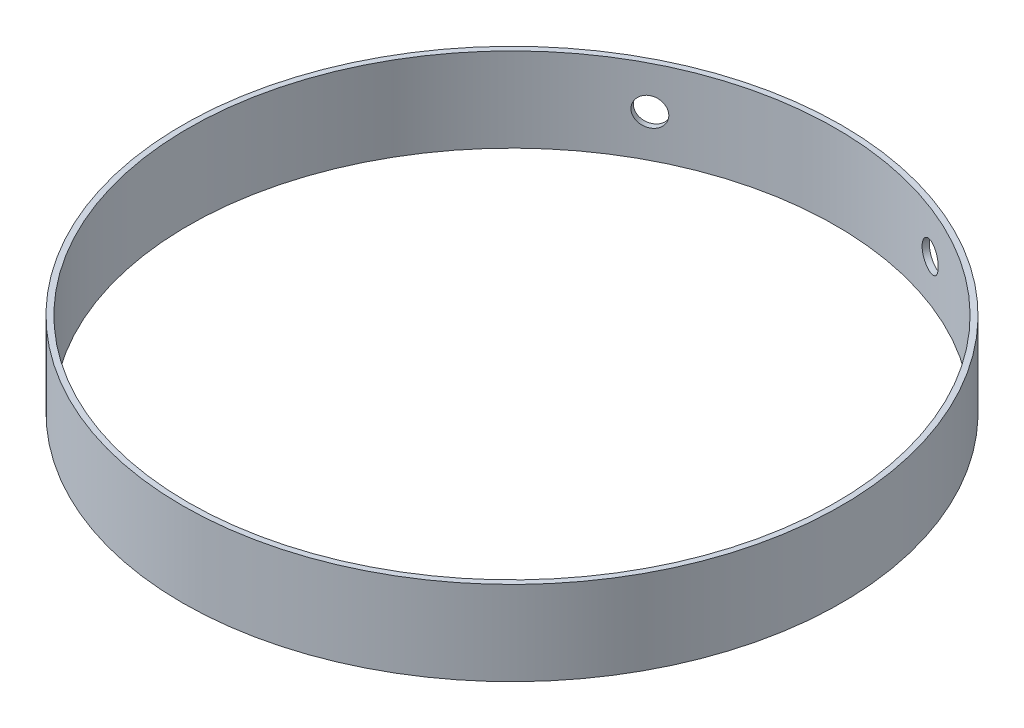
ISO-10303-21;
HEADER;
FILE_DESCRIPTION(('STEP AP214'),'2;1');
FILE_NAME('part.step','',(''),(''),'','','');
FILE_SCHEMA(('AUTOMOTIVE_DESIGN { 1 0 10303 214 1 1 1 1 }'));
ENDSEC;
DATA;
#1=APPLICATION_CONTEXT('core data for automotive mechanical design processes');
#2=APPLICATION_PROTOCOL_DEFINITION('international standard','automotive_design',2000,#1);
#3=PRODUCT_CONTEXT('',#1,'mechanical');
#4=PRODUCT('Part','Part','',(#3));
#5=PRODUCT_RELATED_PRODUCT_CATEGORY('part','',(#4));
#6=PRODUCT_DEFINITION_FORMATION('','',#4);
#7=PRODUCT_DEFINITION_CONTEXT('part definition',#1,'design');
#8=PRODUCT_DEFINITION('design','',#6,#7);
#9=PRODUCT_DEFINITION_SHAPE('','',#8);
#10=(LENGTH_UNIT() NAMED_UNIT(*) SI_UNIT(.MILLI.,.METRE.));
#11=(NAMED_UNIT(*) PLANE_ANGLE_UNIT() SI_UNIT($,.RADIAN.));
#12=(NAMED_UNIT(*) SI_UNIT($,.STERADIAN.) SOLID_ANGLE_UNIT());
#13=UNCERTAINTY_MEASURE_WITH_UNIT(LENGTH_MEASURE(1.E-05),#10,'distance_accuracy_value','');
#14=(GEOMETRIC_REPRESENTATION_CONTEXT(3) GLOBAL_UNCERTAINTY_ASSIGNED_CONTEXT((#13)) GLOBAL_UNIT_ASSIGNED_CONTEXT((#10,
#11,#12)) REPRESENTATION_CONTEXT('',''));
#15=CARTESIAN_POINT('',(0.,0.,0.));
#16=DIRECTION('',(0.,0.,1.));
#17=DIRECTION('',(1.,0.,0.));
#18=AXIS2_PLACEMENT_3D('',#15,#16,#17);
#19=CARTESIAN_POINT('',(0.,19.05,0.));
#20=DIRECTION('',(0.,1.,0.));
#21=DIRECTION('',(0.,0.,1.));
#22=AXIS2_PLACEMENT_3D('',#19,#20,#21);
#23=PLANE('',#22);
#24=CARTESIAN_POINT('',(0.,19.05,0.));
#25=DIRECTION('',(0.,1.,0.));
#26=DIRECTION('',(0.,0.,1.));
#27=AXIS2_PLACEMENT_3D('',#24,#25,#26);
#28=CIRCLE('',#27,74.5363);
#29=CARTESIAN_POINT('',(0.,19.05,74.5363));
#30=VERTEX_POINT('',#29);
#31=EDGE_CURVE('E10',#30,#30,#28,.T.);
#32=ORIENTED_EDGE('',*,*,#31,.T.);
#33=EDGE_LOOP('',(#32));
#34=FACE_BOUND('',#33,.T.);
#35=CARTESIAN_POINT('',(0.,19.05,0.));
#36=DIRECTION('',(0.,1.,0.));
#37=DIRECTION('',(0.,0.,1.));
#38=AXIS2_PLACEMENT_3D('',#35,#36,#37);
#39=CIRCLE('',#38,73.2663);
#40=CARTESIAN_POINT('',(0.,19.05,73.2663));
#41=VERTEX_POINT('',#40);
#42=EDGE_CURVE('E46',#41,#41,#39,.T.);
#43=ORIENTED_EDGE('',*,*,#42,.F.);
#44=EDGE_LOOP('',(#43));
#45=FACE_BOUND('',#44,.T.);
#46=ADVANCED_FACE('F34',(#34,#45),#23,.T.);
#47=CARTESIAN_POINT('',(0.,0.,0.));
#48=DIRECTION('',(0.,1.,0.));
#49=DIRECTION('',(0.,0.,1.));
#50=AXIS2_PLACEMENT_3D('',#47,#48,#49);
#51=PLANE('',#50);
#52=CARTESIAN_POINT('',(0.,0.,0.));
#53=DIRECTION('',(0.,1.,0.));
#54=DIRECTION('',(0.,0.,1.));
#55=AXIS2_PLACEMENT_3D('',#52,#53,#54);
#56=CIRCLE('',#55,74.5363);
#57=CARTESIAN_POINT('',(0.,0.,74.5363));
#58=VERTEX_POINT('',#57);
#59=EDGE_CURVE('E39',#58,#58,#56,.T.);
#60=ORIENTED_EDGE('',*,*,#59,.F.);
#61=EDGE_LOOP('',(#60));
#62=FACE_BOUND('',#61,.T.);
#63=CARTESIAN_POINT('',(0.,0.,0.));
#64=DIRECTION('',(0.,1.,0.));
#65=DIRECTION('',(0.,0.,1.));
#66=AXIS2_PLACEMENT_3D('',#63,#64,#65);
#67=CIRCLE('',#66,73.2663);
#68=CARTESIAN_POINT('',(0.,0.,73.2663));
#69=VERTEX_POINT('',#68);
#70=EDGE_CURVE('E48',#69,#69,#67,.T.);
#71=ORIENTED_EDGE('',*,*,#70,.T.);
#72=EDGE_LOOP('',(#71));
#73=FACE_BOUND('',#72,.T.);
#74=ADVANCED_FACE('F82',(#62,#73),#51,.F.);
#75=CARTESIAN_POINT('',(0.,19.05,0.));
#76=DIRECTION('',(0.,-1.,0.));
#77=DIRECTION('',(0.,0.,-1.));
#78=AXIS2_PLACEMENT_3D('',#75,#76,#77);
#79=CYLINDRICAL_SURFACE('',#78,74.5363);
#80=CARTESIAN_POINT('',(-37.1667467829591,9.525,-64.6087683775306));
#81=CARTESIAN_POINT('',(-37.1667402132214,9.34674567741832,-64.6087728192058));
#82=CARTESIAN_POINT('',(-37.1536811935248,9.16836416291243,-64.6162899196164));
#83=CARTESIAN_POINT('',(-37.1017457517916,8.81651981030925,-64.6461239529001));
#84=CARTESIAN_POINT('',(-37.062838730524,8.64306305629185,-64.6684584267463));
#85=CARTESIAN_POINT('',(-36.9602483380851,8.30621610175844,-64.7271467985176));
#86=CARTESIAN_POINT('',(-36.896577378899,8.14282090571531,-64.7634936731778));
#87=CARTESIAN_POINT('',(-36.7461730914599,7.83069208389128,-64.8489493018005));
#88=CARTESIAN_POINT('',(-36.6594452865916,7.68195495837635,-64.8980549992582));
#89=CARTESIAN_POINT('',(-36.4651748269535,7.40320433388848,-65.0074106438988));
#90=CARTESIAN_POINT('',(-36.3576182324345,7.27320347643779,-65.0676680532043));
#91=CARTESIAN_POINT('',(-36.1246198475546,7.03572304141676,-65.1973127885537));
#92=CARTESIAN_POINT('',(-35.9991773351624,6.92824437347069,-65.2667004831666));
#93=CARTESIAN_POINT('',(-35.7337702568325,6.73882833099386,-65.412388511599));
#94=CARTESIAN_POINT('',(-35.5938004515413,6.65690021438049,-65.4886913381345));
#95=CARTESIAN_POINT('',(-35.303225480649,6.5209705052851,-65.6457884325836));
#96=CARTESIAN_POINT('',(-35.1526203793108,6.46696874407646,-65.7265826733575));
#97=CARTESIAN_POINT('',(-34.845061579055,6.38845643468924,-65.890151031924));
#98=CARTESIAN_POINT('',(-34.6881118260787,6.36392783923639,-65.9729239064372));
#99=CARTESIAN_POINT('',(-34.3721972667486,6.34500246964727,-66.138066471969));
#100=CARTESIAN_POINT('',(-34.2132324729107,6.35060550844891,-66.2204361654875));
#101=CARTESIAN_POINT('',(-33.8979183419501,6.39176931078355,-66.3823964039426));
#102=CARTESIAN_POINT('',(-33.7415673748467,6.42731063554425,-66.461988717304));
#103=CARTESIAN_POINT('',(-33.4358679730185,6.5273120091108,-66.6163049704621));
#104=CARTESIAN_POINT('',(-33.2865195617038,6.59177215458743,-66.6910288939836));
#105=CARTESIAN_POINT('',(-32.9991091664838,6.74780361212208,-66.8337084953538));
#106=CARTESIAN_POINT('',(-32.8610508979961,6.83938380353,-66.9016619467347));
#107=CARTESIAN_POINT('',(-32.6003134357995,7.04704921285761,-67.0291031908332));
#108=CARTESIAN_POINT('',(-32.4776343192424,7.16313455370303,-67.0885909410815));
#109=CARTESIAN_POINT('',(-32.2511833005181,7.41662497156903,-67.1977458187646));
#110=CARTESIAN_POINT('',(-32.147426495837,7.55404691192419,-67.2474051070643));
#111=CARTESIAN_POINT('',(-31.962030806453,7.84625029115226,-67.3357199688448));
#112=CARTESIAN_POINT('',(-31.8803919265279,8.00103173377489,-67.3743755399488));
#113=CARTESIAN_POINT('',(-31.7416818186833,8.32357042022812,-67.4398366304313));
#114=CARTESIAN_POINT('',(-31.6846111332914,8.49132795050693,-67.4666418881256));
#115=CARTESIAN_POINT('',(-31.5967666057735,8.83505229079635,-67.5078271875181));
#116=CARTESIAN_POINT('',(-31.5659926199987,9.01101905595758,-67.5222072970901));
#117=CARTESIAN_POINT('',(-31.5316900565164,9.36601870981616,-67.538232919879));
#118=CARTESIAN_POINT('',(-31.5281400862224,9.54504908023349,-67.5398884320659));
#119=CARTESIAN_POINT('',(-31.5483370922431,9.90122407674261,-67.5304565647718));
#120=CARTESIAN_POINT('',(-31.5720840034449,10.0783687073316,-67.5193692156871));
#121=CARTESIAN_POINT('',(-31.6461394961478,10.4256776613221,-67.4846910503978));
#122=CARTESIAN_POINT('',(-31.6964383293243,10.5958445218621,-67.4611048230434));
#123=CARTESIAN_POINT('',(-31.8220715789749,10.9244455812673,-67.4019329961829));
#124=CARTESIAN_POINT('',(-31.8974060999695,11.0828797311468,-67.3663473465808));
#125=CARTESIAN_POINT('',(-32.0709036883748,11.38362661222,-67.2839234052533));
#126=CARTESIAN_POINT('',(-32.1690809904814,11.5259292083076,-67.2370780963602));
#127=CARTESIAN_POINT('',(-32.3853113197524,11.7902716479776,-67.1331957898005));
#128=CARTESIAN_POINT('',(-32.5033644412114,11.9123113954237,-67.0761587437823));
#129=CARTESIAN_POINT('',(-32.7559368261213,12.1327429392304,-66.9531800922327));
#130=CARTESIAN_POINT('',(-32.8904666087694,12.2311195082798,-66.887232795328));
#131=CARTESIAN_POINT('',(-33.1719806681098,12.4013280695726,-66.7480661737716));
#132=CARTESIAN_POINT('',(-33.3189649017436,12.4731601535829,-66.6748468742609));
#133=CARTESIAN_POINT('',(-33.6210543144419,12.5882140159496,-66.523028101717));
#134=CARTESIAN_POINT('',(-33.77615669406,12.6314455876201,-66.4444304804976));
#135=CARTESIAN_POINT('',(-34.0900516379698,12.6881033254373,-66.2839306085888));
#136=CARTESIAN_POINT('',(-34.2488441889789,12.70152959885,-66.2020283697934));
#137=CARTESIAN_POINT('',(-34.5654551539371,12.6981945034375,-66.0372709202496));
#138=CARTESIAN_POINT('',(-34.7232742402588,12.6814570540477,-65.9544165163201));
#139=CARTESIAN_POINT('',(-35.0336128974261,12.6183189872745,-65.7900967190389));
#140=CARTESIAN_POINT('',(-35.1861324580385,12.5719183126154,-65.7086313283696));
#141=CARTESIAN_POINT('',(-35.4816228990496,12.4507754326645,-65.5495433639191));
#142=CARTESIAN_POINT('',(-35.6245936621601,12.3760328793233,-65.4719208373431));
#143=CARTESIAN_POINT('',(-35.8970456008926,12.200332938489,-65.322938342598));
#144=CARTESIAN_POINT('',(-36.0265272219168,12.0993764169478,-65.2515781676626));
#145=CARTESIAN_POINT('',(-36.2685675906325,11.8740318738225,-65.1173573072599));
#146=CARTESIAN_POINT('',(-36.3811146843261,11.7496278475698,-65.0545024779667));
#147=CARTESIAN_POINT('',(-36.5861684096444,11.480917615475,-64.9394037971662));
#148=CARTESIAN_POINT('',(-36.678670090382,11.3366065072819,-64.8871625672419));
#149=CARTESIAN_POINT('',(-36.841181739815,11.0320896590314,-64.795031498406));
#150=CARTESIAN_POINT('',(-36.9111730838065,10.871870899919,-64.7551518882896));
#151=CARTESIAN_POINT('',(-37.0266249553597,10.5403010931403,-64.689207170113));
#152=CARTESIAN_POINT('',(-37.0721145772972,10.3689635206429,-64.6631256782446));
#153=CARTESIAN_POINT('',(-37.1253732054971,10.0846280866009,-64.6325552999186));
#154=CARTESIAN_POINT('',(-37.140869700125,9.97347363351122,-64.6236486152619));
#155=CARTESIAN_POINT('',(-37.1615585583726,9.74989633255453,-64.6117537545873));
#156=CARTESIAN_POINT('',(-37.1667509282797,9.63747348546152,-64.6087655749579));
#157=CARTESIAN_POINT('',(-37.1667467829591,9.525,-64.6087683775306));
#158=B_SPLINE_CURVE_WITH_KNOTS('',3,(#80,#81,#82,#83,#84,#85,#86,#87,#88,#89,#90,#91,#92,#93,
#94,#95,#96,#97,#98,#99,#100,#101,#102,#103,#104,#105,#106,#107,#108,#109,#110,#111,#112,#113,
#114,#115,#116,#117,#118,#119,#120,#121,#122,#123,#124,#125,#126,#127,#128,#129,#130,#131,#132,
#133,#134,#135,#136,#137,#138,#139,#140,#141,#142,#143,#144,#145,#146,#147,#148,#149,#150,#151,
#152,#153,#154,#155,#156,#157),.UNSPECIFIED.,.T.,.F.,(4,2,2,2,2,2,2,2,2,2,2,2,2,2,2,2,2,2,2,2,2,
2,2,2,2,2,2,2,2,2,2,2,2,2,2,2,2,2,4),(0.,0.534352408645492,1.06933852113084,1.60405683694096,
2.13864717350154,2.67359653096798,3.20856748976114,3.74373206387132,4.27889340456388,
4.81372688317821,5.34855704146281,5.88304020476156,6.41752515476149,6.95218529384125,
7.48684811501236,8.02193567724345,8.55702335505589,9.09212284834633,9.62721941857892,
10.1618954676808,10.696570241389,11.2310488499424,11.7655296898964,12.3003444929653,
12.8351618333699,13.3703224147643,13.9054811460399,14.4404565346553,14.9754299979497,
15.5099794209774,16.0445298761495,16.5790868960225,17.1136262595922,17.6485318161848,
18.1835693354521,18.7190484043913,19.2538902132605,19.5910518240825,19.9282132291731),.UNSPECIFIED.);
#159=CARTESIAN_POINT('',(-37.1667467829591,9.525,-64.6087683775306));
#160=VERTEX_POINT('',#159);
#161=EDGE_CURVE('E99',#160,#160,#158,.T.);
#162=ORIENTED_EDGE('',*,*,#161,.T.);
#163=EDGE_LOOP('',(#162));
#164=FACE_BOUND('',#163,.T.);
#165=CARTESIAN_POINT('',(23.7482364735679,9.525,-70.6518314135274));
#166=CARTESIAN_POINT('',(23.7482441538019,9.34674567741832,-70.6518294376886));
#167=CARTESIAN_POINT('',(23.7625282101297,9.16836416291243,-70.6470325085831));
#168=CARTESIAN_POINT('',(23.819289682496,8.81651981030925,-70.6279145875457));
#169=CARTESIAN_POINT('',(23.8618005137586,8.64306305629185,-70.6135823075011));
#170=CARTESIAN_POINT('',(23.9737411725301,8.30621610175844,-70.5756560301235));
#171=CARTESIAN_POINT('',(24.0431575146117,8.14282090571532,-70.5520666724965));
#172=CARTESIAN_POINT('',(24.2068315459624,7.83069208389129,-70.4960762661328));
#173=CARTESIAN_POINT('',(24.3010832857379,7.68195495837635,-70.4636773277337));
#174=CARTESIAN_POINT('',(24.5117272120399,7.40320433388849,-70.3906786646308));
#175=CARTESIAN_POINT('',(24.6281342251683,7.2732034764378,-70.3500734470443));
#176=CARTESIAN_POINT('',(24.8796386410307,7.03572304141677,-70.2615210130735));
#177=CARTESIAN_POINT('',(25.0147367982954,6.9282443734707,-70.2135735002845));
#178=CARTESIAN_POINT('',(25.2997341746414,6.73882833099386,-70.1113853682334));
#179=CARTESIAN_POINT('',(25.4496387327893,6.65690021438049,-70.0571424776668));
#180=CARTESIAN_POINT('',(25.7598598916161,6.52097050528511,-69.9436693821348));
#181=CARTESIAN_POINT('',(25.9201764293808,6.46696874407646,-69.8844392073043));
#182=CARTESIAN_POINT('',(26.2464997079576,6.38845643468924,-69.7625370276775));
#183=CARTESIAN_POINT('',(26.4125029025434,6.36392783923639,-69.6998671537201));
#184=CARTESIAN_POINT('',(26.7455428777662,6.34500246964727,-69.5727512591564));
#185=CARTESIAN_POINT('',(26.9125796519802,6.35060550844891,-69.508305249579));
#186=CARTESIAN_POINT('',(27.2428386648729,6.39176931078355,-69.3795298465433));
#187=CARTESIAN_POINT('',(27.4060633080906,6.42731063554425,-69.3152004045527));
#188=CARTESIAN_POINT('',(27.7242259961117,6.5273120091108,-69.1885586491239));
#189=CARTESIAN_POINT('',(27.8791640132124,6.59177215458743,-69.1262463424295));
#190=CARTESIAN_POINT('',(28.1764915634243,6.74780361212208,-69.005587601293));
#191=CARTESIAN_POINT('',(28.318876966851,6.83938380353,-68.9472424734464));
#192=CARTESIAN_POINT('',(28.5871157633112,7.04704921285761,-68.8364578040937));
#193=CARTESIAN_POINT('',(28.7129690734094,7.16313455370303,-68.784018292214));
#194=CARTESIAN_POINT('',(28.9447907272329,7.41662497156903,-68.6867888109759));
#195=CARTESIAN_POINT('',(29.0507431947338,7.55404691192418,-68.6420049515782));
#196=CARTESIAN_POINT('',(29.2397492937101,7.84625029115225,-68.5617069378842));
#197=CARTESIAN_POINT('',(29.3228029202393,8.00103173377489,-68.5261927855902));
#198=CARTESIAN_POINT('',(29.4637539845674,8.32357042022812,-68.4657076977569));
#199=CARTESIAN_POINT('',(29.5216508668423,8.49132795050693,-68.4407369950437));
#200=CARTESIAN_POINT('',(29.6107116994715,8.83505229079634,-68.4022524787767));
#201=CARTESIAN_POINT('',(29.6418757958565,9.01101905595757,-68.3887386026386));
#202=CARTESIAN_POINT('',(29.6766107103358,9.36601870981615,-68.3736730072856));
#203=CARTESIAN_POINT('',(29.6802031941597,9.54504908023348,-68.3721118956096));
#204=CARTESIAN_POINT('',(29.6597545139278,9.90122407674261,-68.3809849249473));
#205=CARTESIAN_POINT('',(29.6357134157881,10.0783687073316,-68.3914190373481));
#206=CARTESIAN_POINT('',(29.5606641733983,10.4256776613221,-68.4238905997375));
#207=CARTESIAN_POINT('',(29.5096659262393,10.5958445218621,-68.4459237912095));
#208=CARTESIAN_POINT('',(29.3820913003133,10.9244455812673,-68.5007848277623));
#209=CARTESIAN_POINT('',(29.3055148147608,11.0828797311468,-68.5336127179094));
#210=CARTESIAN_POINT('',(29.1288056269259,11.38362661222,-68.6089053617807));
#211=CARTESIAN_POINT('',(29.0286582357576,11.5259292083076,-68.651376124152));
#212=CARTESIAN_POINT('',(28.8075587292981,11.7902716479776,-68.744446512333));
#213=CARTESIAN_POINT('',(28.6866065153048,11.9123113954237,-68.7950461767077));
#214=CARTESIAN_POINT('',(28.4271209475652,12.1327429392304,-68.9026742329519));
#215=CARTESIAN_POINT('',(28.2885763602202,12.2311195082798,-68.9597067298794));
#216=CARTESIAN_POINT('',(27.9977873038157,12.4013280695726,-69.0782783910683));
#217=CARTESIAN_POINT('',(27.8455428821201,12.4731601535829,-69.1398175397489));
#218=CARTESIAN_POINT('',(27.5316429470931,12.5882140159496,-69.2654112647161));
#219=CARTESIAN_POINT('',(27.3699906758228,12.6314455876201,-69.329464972007));
#220=CARTESIAN_POINT('',(27.0417658126808,12.6881033254373,-69.4581455218593));
#221=CARTESIAN_POINT('',(26.8751932385189,12.70152959885,-69.5227723623573));
#222=CARTESIAN_POINT('',(26.5419800980381,12.6981945034375,-69.65066498655));
#223=CARTESIAN_POINT('',(26.3753396902659,12.6814570540477,-69.7139318084667));
#224=CARTESIAN_POINT('',(26.0466113271721,12.6183189872745,-69.8374176020164));
#225=CARTESIAN_POINT('',(25.8845233806414,12.5719183126154,-69.8976365677642));
#226=CARTESIAN_POINT('',(25.5695536100335,12.4507754326645,-70.0134710391671));
#227=CARTESIAN_POINT('',(25.4166718990393,12.3760328793233,-70.069086488279));
#228=CARTESIAN_POINT('',(25.1245384592945,12.200332938489,-70.1743665720671));
#229=CARTESIAN_POINT('',(24.9852862805153,12.0993764169478,-70.2240314032368));
#230=CARTESIAN_POINT('',(24.7243624386484,11.8740318738225,-70.3163218588685));
#231=CARTESIAN_POINT('',(24.6027028846703,11.7496278475698,-70.3589426377237));
#232=CARTESIAN_POINT('',(24.3806116584017,11.480917615475,-70.4362098610684));
#233=CARTESIAN_POINT('',(24.2801852304925,11.3366065072819,-70.4708543356736));
#234=CARTESIAN_POINT('',(24.1034881259765,11.0320896590314,-70.5314868624391));
#235=CARTESIAN_POINT('',(24.0272374527504,10.871870899919,-70.5574677471303));
#236=CARTESIAN_POINT('',(23.9013389204759,10.5403010931403,-70.6002158473415));
#237=CARTESIAN_POINT('',(23.8516595100848,10.3689635206429,-70.6169939910196));
#238=CARTESIAN_POINT('',(23.793469682336,10.0846280866009,-70.6366147314566));
#239=CARTESIAN_POINT('',(23.7765295971228,9.97347363351122,-70.6423159497737));
#240=CARTESIAN_POINT('',(23.7539105731682,9.74989633255453,-70.6499249130012));
#241=CARTESIAN_POINT('',(23.7482316275554,9.63747348546152,-70.6518326602264));
#242=CARTESIAN_POINT('',(23.7482364735679,9.525,-70.6518314135274));
#243=B_SPLINE_CURVE_WITH_KNOTS('',3,(#165,#166,#167,#168,#169,#170,#171,#172,#173,#174,#175,
#176,#177,#178,#179,#180,#181,#182,#183,#184,#185,#186,#187,#188,#189,#190,#191,#192,#193,#194,
#195,#196,#197,#198,#199,#200,#201,#202,#203,#204,#205,#206,#207,#208,#209,#210,#211,#212,#213,
#214,#215,#216,#217,#218,#219,#220,#221,#222,#223,#224,#225,#226,#227,#228,#229,#230,#231,#232,
#233,#234,#235,#236,#237,#238,#239,#240,#241,#242),.UNSPECIFIED.,.T.,.F.,(4,2,2,2,2,2,2,2,2,2,2,
2,2,2,2,2,2,2,2,2,2,2,2,2,2,2,2,2,2,2,2,2,2,2,2,2,2,2,4),(0.,0.534352408645491,1.06933852113084,
1.60405683694095,2.13864717350154,2.67359653096797,3.20856748976113,3.74373206387132,
4.27889340456388,4.8137268831782,5.34855704146281,5.88304020476158,6.41752515476149,
6.95218529384125,7.48684811501235,8.02193567724344,8.55702335505589,9.09212284834632,
9.62721941857891,10.1618954676808,10.696570241389,11.2310488499424,11.7655296898964,
12.3003444929652,12.8351618333699,13.3703224147643,13.9054811460398,14.4404565346553,
14.9754299979497,15.5099794209774,16.0445298761495,16.5790868960225,17.1136262595922,
17.6485318161848,18.1835693354521,18.7190484043913,19.2538902132605,19.5910518240825,
19.9282132291731),.UNSPECIFIED.);
#244=CARTESIAN_POINT('',(23.7482364735679,9.525,-70.6518314135274));
#245=VERTEX_POINT('',#244);
#246=EDGE_CURVE('E51',#245,#245,#243,.T.);
#247=ORIENTED_EDGE('',*,*,#246,.T.);
#248=EDGE_LOOP('',(#247));
#249=FACE_BOUND('',#248,.T.);
#250=ORIENTED_EDGE('',*,*,#31,.F.);
#251=EDGE_LOOP('',(#250));
#252=FACE_BOUND('',#251,.T.);
#253=ORIENTED_EDGE('',*,*,#59,.T.);
#254=EDGE_LOOP('',(#253));
#255=FACE_BOUND('',#254,.T.);
#256=ADVANCED_FACE('F36',(#164,#249,#252,#255),#79,.T.);
#257=CARTESIAN_POINT('',(0.,19.05,0.));
#258=DIRECTION('',(0.,-1.,0.));
#259=DIRECTION('',(0.,0.,-1.));
#260=AXIS2_PLACEMENT_3D('',#257,#258,#259);
#261=CYLINDRICAL_SURFACE('',#260,73.2663);
#262=CARTESIAN_POINT('',(-36.580400407934,9.525,-63.4809028108865));
#263=CARTESIAN_POINT('',(-36.5803938464011,9.34674871420285,-63.4809072659173));
#264=CARTESIAN_POINT('',(-36.5673404444929,9.16837031071228,-63.4884340649076));
#265=CARTESIAN_POINT('',(-36.5154270093523,8.8165323028638,-63.5183057730564));
#266=CARTESIAN_POINT('',(-36.4765364062939,8.64307877927862,-63.5406682352965));
#267=CARTESIAN_POINT('',(-36.3739881144487,8.30623830223545,-63.5994274852588));
#268=CARTESIAN_POINT('',(-36.3103428532041,8.14284634518587,-63.6358172308042));
#269=CARTESIAN_POINT('',(-36.1599966312319,7.83072335987366,-63.7213685020476));
#270=CARTESIAN_POINT('',(-36.07330118492,7.68198883668646,-63.7705269729523));
#271=CARTESIAN_POINT('',(-35.8790967864998,7.40323948274773,-63.879993154766));
#272=CARTESIAN_POINT('',(-35.7715734851144,7.27323766613174,-63.9403085509008));
#273=CARTESIAN_POINT('',(-35.5386403572986,7.03575461538414,-64.0700670619264));
#274=CARTESIAN_POINT('',(-35.4132298080761,6.92827429173959,-64.1395105456581));
#275=CARTESIAN_POINT('',(-35.1478798469253,6.73885292475098,-64.2853027381926));
#276=CARTESIAN_POINT('',(-35.0079350006841,6.65692148018555,-64.3616540284104));
#277=CARTESIAN_POINT('',(-34.7174015935353,6.5209853687595,-64.5188344079288));
#278=CARTESIAN_POINT('',(-34.5668130984441,6.46698052922817,-64.5996634695397));
#279=CARTESIAN_POINT('',(-34.2592806103254,6.3884635274435,-64.7632821044719));
#280=CARTESIAN_POINT('',(-34.1023407078809,6.36393268554033,-64.8460704021286));
#281=CARTESIAN_POINT('',(-33.7864351291124,6.34500239739873,-65.0112242644194));
#282=CARTESIAN_POINT('',(-33.6274694656826,6.35060275946541,-65.0935898317395));
#283=CARTESIAN_POINT('',(-33.3121468707115,6.39176033946484,-65.2555207425097));
#284=CARTESIAN_POINT('',(-33.1557882591113,6.4272974391546,-65.3350879291425));
#285=CARTESIAN_POINT('',(-32.8500642453755,6.52728855895198,-65.4893375346059));
#286=CARTESIAN_POINT('',(-32.7006988671714,6.59174267800821,-65.5640199367207));
#287=CARTESIAN_POINT('',(-32.4132454547827,6.74776122124368,-65.7066055574125));
#288=CARTESIAN_POINT('',(-32.2751612627152,6.83933483300549,-65.7745064681039));
#289=CARTESIAN_POINT('',(-32.0143673283214,7.04698618584296,-65.9018367994647));
#290=CARTESIAN_POINT('',(-31.8916576660358,7.16306405448069,-65.961266176031));
#291=CARTESIAN_POINT('',(-31.6651407482757,7.4165426806232,-66.0703067077168));
#292=CARTESIAN_POINT('',(-31.5613491169859,7.5539608909747,-66.1199097502896));
#293=CARTESIAN_POINT('',(-31.3758866540762,7.84615800397556,-66.2081190882361));
#294=CARTESIAN_POINT('',(-31.2942158273273,8.00093691044776,-66.2467253811882));
#295=CARTESIAN_POINT('',(-31.1554479316343,8.32347216702114,-66.3121006514605));
#296=CARTESIAN_POINT('',(-31.0983514275455,8.49122881531885,-66.338869356687));
#297=CARTESIAN_POINT('',(-31.01046420703,8.83495288994055,-66.3799984929011));
#298=CARTESIAN_POINT('',(-30.9796733419012,9.01092026984446,-66.3943589940306));
#299=CARTESIAN_POINT('',(-30.9453481061795,9.36591746025351,-66.4103644965215));
#300=CARTESIAN_POINT('',(-30.9417915868868,9.54494466352166,-66.4120198305343));
#301=CARTESIAN_POINT('',(-30.9619849158329,9.90111427453678,-66.4026078183495));
#302=CARTESIAN_POINT('',(-30.9857346966092,10.0782566869392,-66.3915405035843));
#303=CARTESIAN_POINT('',(-31.0598038956637,10.4255598885417,-66.3569208945367));
#304=CARTESIAN_POINT('',(-31.1101132184406,10.5957233040485,-66.3333733440817));
#305=CARTESIAN_POINT('',(-31.2357732453804,10.9243190089853,-66.2742934924973));
#306=CARTESIAN_POINT('',(-31.3111240578327,11.0827512476813,-66.2387611395407));
#307=CARTESIAN_POINT('',(-31.4846593656843,11.3834996876327,-66.1564519421464));
#308=CARTESIAN_POINT('',(-31.582858594668,11.5258054014242,-66.109667841468));
#309=CARTESIAN_POINT('',(-31.7991340441293,11.7901558212292,-66.005909861999));
#310=CARTESIAN_POINT('',(-31.9172103619369,11.9122004280261,-65.9489359333128));
#311=CARTESIAN_POINT('',(-32.1698303754113,12.1326460832156,-65.8260771467403));
#312=CARTESIAN_POINT('',(-32.3043849585886,12.2310313708415,-65.760186394283));
#313=CARTESIAN_POINT('',(-32.5859448139595,12.4012578674416,-65.6211211223536));
#314=CARTESIAN_POINT('',(-32.7329500420726,12.4730991703877,-65.5479466286689));
#315=CARTESIAN_POINT('',(-33.0350733552392,12.5881707768976,-65.3962016223736));
#316=CARTESIAN_POINT('',(-33.1901885464394,12.6314112118473,-65.3176330314308));
#317=CARTESIAN_POINT('',(-33.504100893403,12.6880868369643,-65.157171505215));
#318=CARTESIAN_POINT('',(-33.662898035217,12.7015221400316,-65.0752785825354));
#319=CARTESIAN_POINT('',(-33.9795047523451,12.6982049656345,-64.9105214415616));
#320=CARTESIAN_POINT('',(-34.1373150309014,12.6814772419516,-64.8276580751184));
#321=CARTESIAN_POINT('',(-34.4476277832648,12.6183599429013,-64.6633009990153));
#322=CARTESIAN_POINT('',(-34.6001302468439,12.571970310379,-64.5818072919948));
#323=CARTESIAN_POINT('',(-34.8955800444972,12.4508507216438,-64.4226465608183));
#324=CARTESIAN_POINT('',(-35.0385272650124,12.3761204286874,-64.3449795821438));
#325=CARTESIAN_POINT('',(-35.3109287512791,12.2004459315241,-64.1958967995998));
#326=CARTESIAN_POINT('',(-35.4403834596238,12.0995025875598,-64.1244807906929));
#327=CARTESIAN_POINT('',(-35.6823735809326,11.8741816641607,-63.990140911019));
#328=CARTESIAN_POINT('',(-35.7948968714634,11.7497874367399,-63.9272231280179));
#329=CARTESIAN_POINT('',(-35.99990581773,11.48109536374,-63.8120001732196));
#330=CARTESIAN_POINT('',(-36.0923865245279,11.3367926166891,-63.7596976227499));
#331=CARTESIAN_POINT('',(-36.254863230799,11.0322885518185,-63.6674514297803));
#332=CARTESIAN_POINT('',(-36.32484033108,10.8720740178211,-63.6275181764111));
#333=CARTESIAN_POINT('',(-36.4402715506518,10.5405099372402,-63.561480387774));
#334=CARTESIAN_POINT('',(-36.4857547440455,10.3691738638754,-63.5353594580404));
#335=CARTESIAN_POINT('',(-36.5390166364684,10.0848052195171,-63.5047360614558));
#336=CARTESIAN_POINT('',(-36.5545169579057,9.97361611748146,-63.49581207131));
#337=CARTESIAN_POINT('',(-36.575210911147,9.74996822406049,-63.4838940419281));
#338=CARTESIAN_POINT('',(-36.5804045494713,9.6375094334785,-63.4808999989406));
#339=CARTESIAN_POINT('',(-36.580400407934,9.525,-63.4809028108865));
#340=B_SPLINE_CURVE_WITH_KNOTS('',3,(#262,#263,#264,#265,#266,#267,#268,#269,#270,#271,#272,
#273,#274,#275,#276,#277,#278,#279,#280,#281,#282,#283,#284,#285,#286,#287,#288,#289,#290,#291,
#292,#293,#294,#295,#296,#297,#298,#299,#300,#301,#302,#303,#304,#305,#306,#307,#308,#309,#310,
#311,#312,#313,#314,#315,#316,#317,#318,#319,#320,#321,#322,#323,#324,#325,#326,#327,#328,#329,
#330,#331,#332,#333,#334,#335,#336,#337,#338,#339),.UNSPECIFIED.,.T.,.F.,(4,2,2,2,2,2,2,2,2,2,2,
2,2,2,2,2,2,2,2,2,2,2,2,2,2,2,2,2,2,2,2,2,2,2,2,2,2,2,4),(0.,0.534343165931115,1.06931967980122,
1.6040279661884,2.13860844645307,2.67355854244199,3.2085302609409,3.74370272818508,
4.27887188640855,4.81370169282169,5.3485280966488,5.88299537009653,6.4174644724048,
6.95211485049863,7.48676801189619,8.02186075595443,8.55695361784056,9.09205877849644,
9.62716091425515,10.1618278247039,10.6964934142146,11.2309559190869,11.7654207352192,
12.30023115578,12.8350441951712,13.3702125219442,13.9053789540765,14.4403557106509,
14.9753304407596,15.5098663348972,16.0444032590238,16.5789465347121,17.1134722703258,
17.6483789091788,18.1834174776891,18.7189042209533,19.2537539361557,19.591023227912,
19.9282923062986),.UNSPECIFIED.);
#341=CARTESIAN_POINT('',(-36.580400407934,9.525,-63.4809028108865));
#342=VERTEX_POINT('',#341);
#343=EDGE_CURVE('E104',#342,#342,#340,.T.);
#344=ORIENTED_EDGE('',*,*,#343,.F.);
#345=EDGE_LOOP('',(#344));
#346=FACE_BOUND('',#345,.T.);
#347=CARTESIAN_POINT('',(23.2922656666546,9.525,-69.4652508510837));
#348=CARTESIAN_POINT('',(23.2922733514517,9.34674871420285,-69.4652488902405));
#349=CARTESIAN_POINT('',(23.3065609471043,9.16837031071228,-69.4604625957564));
#350=CARTESIAN_POINT('',(23.3633360463831,8.8165323028638,-69.4413861233962));
#351=CARTESIAN_POINT('',(23.4058569548119,8.64307877927862,-69.4270846874517));
#352=CARTESIAN_POINT('',(23.5178227865808,8.30623830223545,-69.3892369116546));
#353=CARTESIAN_POINT('',(23.5872542000211,8.14284634518588,-69.3656952106236));
#354=CARTESIAN_POINT('',(23.7509613677896,7.83072335987366,-69.3098116737466));
#355=CARTESIAN_POINT('',(23.84523117985,7.68198883668646,-69.277471942656));
#356=CARTESIAN_POINT('',(24.0559140967687,7.40323948274773,-69.204596008046));
#357=CARTESIAN_POINT('',(24.1723424667146,7.27323766613173,-69.1640541528416));
#358=CARTESIAN_POINT('',(24.4238888312438,7.03575461538413,-69.0756259915478));
#359=CARTESIAN_POINT('',(24.5590075810654,6.92827429173958,-69.0277393886644));
#360=CARTESIAN_POINT('',(24.8440451034569,6.73885292475098,-68.9256630637122));
#361=CARTESIAN_POINT('',(24.9939694107255,6.65692148018555,-68.8714709831338));
#362=CARTESIAN_POINT('',(25.3042253889923,6.5209853687595,-68.7580842099867));
#363=CARTESIAN_POINT('',(25.4645569956351,6.46698052922817,-68.6988895483515));
#364=CARTESIAN_POINT('',(25.7909004839483,6.3884635274435,-68.5770403933233));
#365=CARTESIAN_POINT('',(25.9569086992783,6.36393268554033,-68.5143881176176));
#366=CARTESIAN_POINT('',(26.28995118187,6.34500239739873,-68.387286435033));
#367=CARTESIAN_POINT('',(26.4569854425972,6.35060275946541,-68.3228370395899));
#368=CARTESIAN_POINT('',(26.7872281036781,6.39176033946484,-68.1940358611623));
#369=CARTESIAN_POINT('',(26.9504389977419,6.4272974391546,-68.1296840416922));
#370=CARTESIAN_POINT('',(27.2685680898414,6.52728855895198,-68.0029796845442));
#371=CARTESIAN_POINT('',(27.4234862594989,6.59174267800821,-67.9406271537083));
#372=CARTESIAN_POINT('',(27.720771944357,6.74776122124368,-67.8198739131705));
#373=CARTESIAN_POINT('',(27.8631351849333,6.8393348330055,-67.7614745509796));
#374=CARTESIAN_POINT('',(28.1313283542998,7.04698618584296,-67.650574084767));
#375=CARTESIAN_POINT('',(28.2571581970165,7.16306405448069,-67.5980730114522));
#376=CARTESIAN_POINT('',(28.4889379005746,7.4165426806232,-67.5007183988221));
#377=CARTESIAN_POINT('',(28.5948713313768,7.5539608909747,-67.4558711826681));
#378=CARTESIAN_POINT('',(28.7838426659645,7.84615800397556,-67.375453229737));
#379=CARTESIAN_POINT('',(28.8668805647085,8.00093691044776,-67.3398824950027));
#380=CARTESIAN_POINT('',(29.007805663936,8.32347216702113,-67.279297255497));
#381=CARTESIAN_POINT('',(29.0656922863028,8.49122881531885,-67.2542829933727));
#382=CARTESIAN_POINT('',(29.1547393575956,8.83495288994055,-67.2157292844742));
#383=CARTESIAN_POINT('',(29.1858999576,9.01092026984446,-67.2021897728346));
#384=CARTESIAN_POINT('',(29.2206348317134,9.36591746025351,-67.1870938648572));
#385=CARTESIAN_POINT('',(29.2242315225459,9.54494466352166,-67.1855277310096));
#386=CARTESIAN_POINT('',(29.2038001474359,9.90111427453678,-67.1944111660666));
#387=CARTESIAN_POINT('',(29.1797721497427,10.0782566869392,-67.2048607052854));
#388=CARTESIAN_POINT('',(29.104757671948,10.4255598885417,-67.2373813402788));
#389=CARTESIAN_POINT('',(29.0537814350849,10.5957233040485,-67.2594480202732));
#390=CARTESIAN_POINT('',(28.9262579359912,10.9243190089853,-67.3143900662183));
#391=CARTESIAN_POINT('',(28.8497105631807,11.0827512476813,-67.3472654789103));
#392=CARTESIAN_POINT('',(28.6730622999725,11.3834996876327,-67.422662416198));
#393=CARTESIAN_POINT('',(28.5729462110192,11.5258054014242,-67.4651901645747));
#394=CARTESIAN_POINT('',(28.3519099004035,11.7901558212292,-67.5583767394262));
#395=CARTESIAN_POINT('',(28.230989576871,11.9122004280261,-67.6090356057157));
#396=CARTESIAN_POINT('',(27.9715622011557,12.1326460832156,-67.7167787696537));
#397=CARTESIAN_POINT('',(27.8330435191096,12.2310313708415,-67.7738673134924));
#398=CARTESIAN_POINT('',(27.5423000044209,12.4012578674416,-67.8925404388398));
#399=CARTESIAN_POINT('',(27.3900752203035,12.4730991703877,-67.9541250044305));
#400=CARTESIAN_POINT('',(27.0762080556726,12.5881707768976,-68.0797930045774));
#401=CARTESIAN_POINT('',(26.9145690320986,12.6314112118473,-68.1438755457397));
#402=CARTESIAN_POINT('',(26.5863613492576,12.6880868369643,-68.2725945416023));
#403=CARTESIAN_POINT('',(26.4197927086662,12.7015221400316,-68.3372309942034));
#404=CARTESIAN_POINT('',(26.0865826145544,12.6982049656345,-68.4651206420036));
#405=CARTESIAN_POINT('',(25.9199413328427,12.6814772419516,-68.5283749283862));
#406=CARTESIAN_POINT('',(25.5912022229936,12.6183599429013,-68.651816616645));
#407=CARTESIAN_POINT('',(25.4291044036116,12.571970310379,-68.7120040126115));
#408=CARTESIAN_POINT('',(25.114107080014,12.4508507216438,-68.8277598220051));
#409=CARTESIAN_POINT('',(24.961207685119,12.3761204286874,-68.8833281805393));
#410=CARTESIAN_POINT('',(24.6690325848975,12.2004459315241,-68.9885040170321));
#411=CARTESIAN_POINT('',(24.5297564326987,12.0995025875598,-69.0381116905264));
#412=CARTESIAN_POINT('',(24.2687767677677,11.8741816641607,-69.1302856378994));
#413=CARTESIAN_POINT('',(24.1470858480293,11.7497874367399,-69.1728468688834));
#414=CARTESIAN_POINT('',(23.9249312395806,11.48109536374,-69.2499981962004));
#415=CARTESIAN_POINT('',(23.8244727937685,11.3367926166891,-69.2845863239394));
#416=CARTESIAN_POINT('',(23.6477126399032,11.0322885518185,-69.3451163842699));
#417=CARTESIAN_POINT('',(23.5714312372151,10.8720740178211,-69.3710510501118));
#418=CARTESIAN_POINT('',(23.4454766983777,10.5405099372402,-69.4137220018957));
#419=CARTESIAN_POINT('',(23.3957720163408,10.3691738638754,-69.4304691937514));
#420=CARTESIAN_POINT('',(23.3375403235425,10.0848052195171,-69.4500572400219));
#421=CARTESIAN_POINT('',(23.3205847431999,9.97361611748146,-69.4557498545381));
#422=CARTESIAN_POINT('',(23.2979449930592,9.74996822406049,-69.4633472776976));
#423=CARTESIAN_POINT('',(23.2922608161304,9.6375094334785,-69.4652520887373));
#424=CARTESIAN_POINT('',(23.2922656666546,9.525,-69.4652508510837));
#425=B_SPLINE_CURVE_WITH_KNOTS('',3,(#347,#348,#349,#350,#351,#352,#353,#354,#355,#356,#357,
#358,#359,#360,#361,#362,#363,#364,#365,#366,#367,#368,#369,#370,#371,#372,#373,#374,#375,#376,
#377,#378,#379,#380,#381,#382,#383,#384,#385,#386,#387,#388,#389,#390,#391,#392,#393,#394,#395,
#396,#397,#398,#399,#400,#401,#402,#403,#404,#405,#406,#407,#408,#409,#410,#411,#412,#413,#414,
#415,#416,#417,#418,#419,#420,#421,#422,#423,#424),.UNSPECIFIED.,.T.,.F.,(4,2,2,2,2,2,2,2,2,2,2,
2,2,2,2,2,2,2,2,2,2,2,2,2,2,2,2,2,2,2,2,2,2,2,2,2,2,2,4),(0.,0.534343165931117,1.06931967980122,
1.6040279661884,2.13860844645307,2.673558542442,3.2085302609409,3.74370272818508,
4.27887188640855,4.8137016928217,5.34852809664879,5.88299537009652,6.4174644724048,
6.95211485049864,7.48676801189618,8.02186075595443,8.55695361784056,9.09205877849644,
9.62716091425514,10.1618278247039,10.6964934142146,11.2309559190869,11.7654207352192,
12.30023115578,12.8350441951712,13.3702125219442,13.9053789540765,14.4403557106509,
14.9753304407596,15.5098663348972,16.0444032590238,16.5789465347121,17.1134722703258,
17.6483789091788,18.1834174776891,18.7189042209533,19.2537539361557,19.591023227912,
19.9282923062986),.UNSPECIFIED.);
#426=CARTESIAN_POINT('',(23.2922656666546,9.525,-69.4652508510837));
#427=VERTEX_POINT('',#426);
#428=EDGE_CURVE('E60',#427,#427,#425,.T.);
#429=ORIENTED_EDGE('',*,*,#428,.F.);
#430=EDGE_LOOP('',(#429));
#431=FACE_BOUND('',#430,.T.);
#432=ORIENTED_EDGE('',*,*,#42,.T.);
#433=EDGE_LOOP('',(#432));
#434=FACE_BOUND('',#433,.T.);
#435=ORIENTED_EDGE('',*,*,#70,.F.);
#436=EDGE_LOOP('',(#435));
#437=FACE_BOUND('',#436,.T.);
#438=ADVANCED_FACE('F71',(#346,#431,#434,#437),#261,.F.);
#439=CARTESIAN_POINT('',(26.7362158388012,9.525,-69.5761078266889));
#440=DIRECTION('',(0.358700604119083,0.,-0.933452664362047));
#441=DIRECTION('',(-0.933452664362047,0.,-0.358700604119083));
#442=AXIS2_PLACEMENT_3D('',#439,#440,#441);
#443=CYLINDRICAL_SURFACE('',#442,3.17499999999999);
#444=ORIENTED_EDGE('',*,*,#428,.T.);
#445=EDGE_LOOP('',(#444));
#446=FACE_BOUND('',#445,.T.);
#447=ORIENTED_EDGE('',*,*,#246,.F.);
#448=EDGE_LOOP('',(#447));
#449=FACE_BOUND('',#448,.T.);
#450=ADVANCED_FACE('F66',(#446,#449),#443,.F.);
#451=CARTESIAN_POINT('',(-34.3808923757515,9.525,-66.1333067155801));
#452=DIRECTION('',(-0.461263738282576,0.,-0.887263074710981));
#453=DIRECTION('',(-0.887263074710981,0.,0.461263738282576));
#454=AXIS2_PLACEMENT_3D('',#451,#452,#453);
#455=CYLINDRICAL_SURFACE('',#454,3.17499999999999);
#456=ORIENTED_EDGE('',*,*,#343,.T.);
#457=EDGE_LOOP('',(#456));
#458=FACE_BOUND('',#457,.T.);
#459=ORIENTED_EDGE('',*,*,#161,.F.);
#460=EDGE_LOOP('',(#459));
#461=FACE_BOUND('',#460,.T.);
#462=ADVANCED_FACE('F70',(#458,#461),#455,.F.);
#463=CLOSED_SHELL('',(#46,#74,#256,#438,#450,#462));
#464=MANIFOLD_SOLID_BREP('B2',#463);
#465=ADVANCED_BREP_SHAPE_REPRESENTATION('',(#18,#464),#14);
#466=SHAPE_DEFINITION_REPRESENTATION(#9,#465);
ENDSEC;
END-ISO-10303-21;
